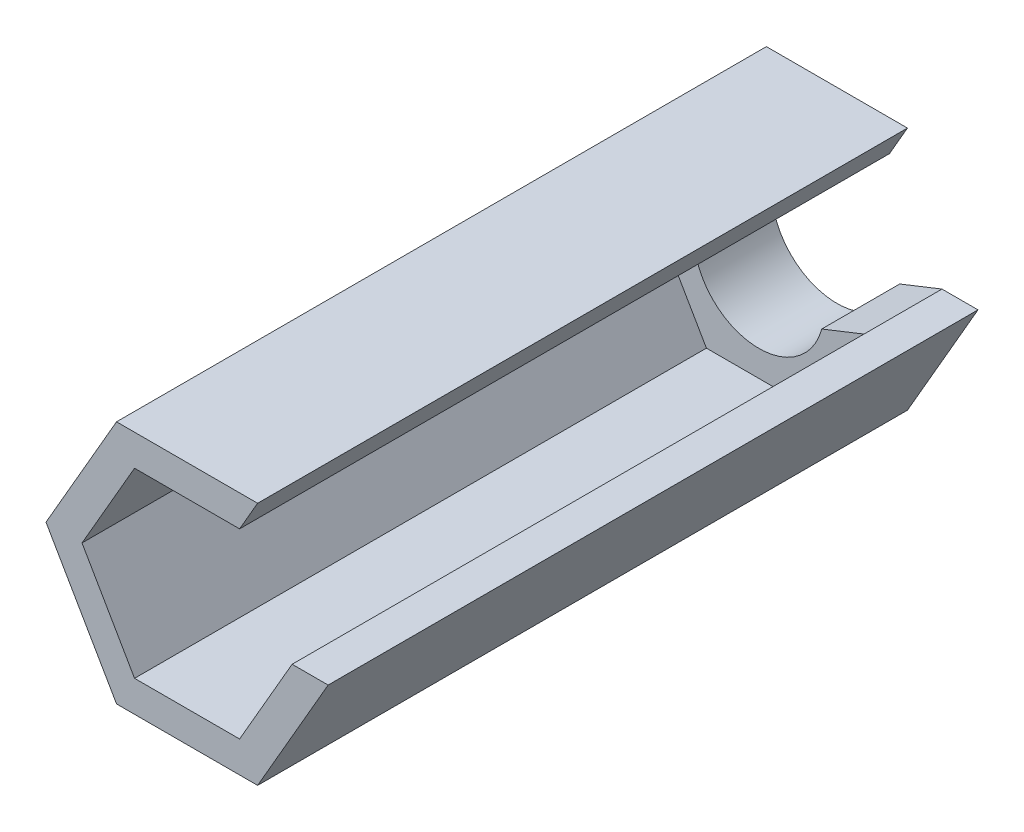
ISO-10303-21;
HEADER;
FILE_DESCRIPTION(('STEP AP214'),'2;1');
FILE_NAME('part.step','',(''),(''),'','','');
FILE_SCHEMA(('AUTOMOTIVE_DESIGN { 1 0 10303 214 1 1 1 1 }'));
ENDSEC;
DATA;
#1=APPLICATION_CONTEXT('core data for automotive mechanical design processes');
#2=APPLICATION_PROTOCOL_DEFINITION('international standard','automotive_design',2000,#1);
#3=PRODUCT_CONTEXT('',#1,'mechanical');
#4=PRODUCT('Part','Part','',(#3));
#5=PRODUCT_RELATED_PRODUCT_CATEGORY('part','',(#4));
#6=PRODUCT_DEFINITION_FORMATION('','',#4);
#7=PRODUCT_DEFINITION_CONTEXT('part definition',#1,'design');
#8=PRODUCT_DEFINITION('design','',#6,#7);
#9=PRODUCT_DEFINITION_SHAPE('','',#8);
#10=(LENGTH_UNIT() NAMED_UNIT(*) SI_UNIT(.MILLI.,.METRE.));
#11=(NAMED_UNIT(*) PLANE_ANGLE_UNIT() SI_UNIT($,.RADIAN.));
#12=(NAMED_UNIT(*) SI_UNIT($,.STERADIAN.) SOLID_ANGLE_UNIT());
#13=UNCERTAINTY_MEASURE_WITH_UNIT(LENGTH_MEASURE(1.E-05),#10,'distance_accuracy_value','');
#14=(GEOMETRIC_REPRESENTATION_CONTEXT(3) GLOBAL_UNCERTAINTY_ASSIGNED_CONTEXT((#13)) GLOBAL_UNIT_ASSIGNED_CONTEXT((#10,
#11,#12)) REPRESENTATION_CONTEXT('',''));
#15=CARTESIAN_POINT('',(0.,0.,0.));
#16=DIRECTION('',(0.,0.,1.));
#17=DIRECTION('',(1.,0.,0.));
#18=AXIS2_PLACEMENT_3D('',#15,#16,#17);
#19=CARTESIAN_POINT('',(5.13264389309574,0.,31.75));
#20=DIRECTION('',(0.,-1.,0.));
#21=DIRECTION('',(1.,0.,0.));
#22=AXIS2_PLACEMENT_3D('',#19,#20,#21);
#23=PLANE('',#22);
#24=DIRECTION('',(-1.,0.,0.));
#25=VECTOR('',#24,1.);
#26=CARTESIAN_POINT('',(5.13264389309574,0.,0.));
#27=LINE('',#26,#25);
#28=CARTESIAN_POINT('',(6.89240751358575,0.,0.));
#29=VERTEX_POINT('',#28);
#30=CARTESIAN_POINT('',(5.13264389309577,0.,0.));
#31=VERTEX_POINT('',#30);
#32=EDGE_CURVE('E153',#29,#31,#27,.T.);
#33=ORIENTED_EDGE('',*,*,#32,.T.);
#34=DIRECTION('',(0.,0.,-1.));
#35=VECTOR('',#34,1.);
#36=CARTESIAN_POINT('',(5.13264389309577,0.,3.81));
#37=LINE('',#36,#35);
#38=CARTESIAN_POINT('',(5.13264389309577,0.,3.81));
#39=VERTEX_POINT('',#38);
#40=EDGE_CURVE('E160',#39,#31,#37,.T.);
#41=ORIENTED_EDGE('',*,*,#40,.F.);
#42=DIRECTION('',(0.,0.,-1.));
#43=VECTOR('',#42,1.);
#44=CARTESIAN_POINT('',(5.13264389309574,0.,31.75));
#45=LINE('',#44,#43);
#46=CARTESIAN_POINT('',(5.13264389309574,0.,31.75));
#47=VERTEX_POINT('',#46);
#48=EDGE_CURVE('E11',#47,#39,#45,.T.);
#49=ORIENTED_EDGE('',*,*,#48,.F.);
#50=DIRECTION('',(-1.,0.,0.));
#51=VECTOR('',#50,1.);
#52=CARTESIAN_POINT('',(5.13264389309574,0.,31.75));
#53=LINE('',#52,#51);
#54=CARTESIAN_POINT('',(6.89240751358575,0.,31.75));
#55=VERTEX_POINT('',#54);
#56=EDGE_CURVE('E170',#55,#47,#53,.T.);
#57=ORIENTED_EDGE('',*,*,#56,.F.);
#58=DIRECTION('',(0.,0.,-1.));
#59=VECTOR('',#58,1.);
#60=CARTESIAN_POINT('',(6.89240751358575,0.,31.75));
#61=LINE('',#60,#59);
#62=EDGE_CURVE('E149',#55,#29,#61,.T.);
#63=ORIENTED_EDGE('',*,*,#62,.T.);
#64=EDGE_LOOP('',(#33,#41,#49,#57,#63));
#65=FACE_BOUND('',#64,.T.);
#66=ADVANCED_FACE('F39',(#65),#23,.F.);
#67=CARTESIAN_POINT('',(2.5663219465478,-4.44500000000005,31.75));
#68=DIRECTION('',(0.866025403784433,-0.50000000000001,0.));
#69=DIRECTION('',(0.50000000000001,0.866025403784433,0.));
#70=AXIS2_PLACEMENT_3D('',#67,#68,#69);
#71=PLANE('',#70);
#72=ORIENTED_EDGE('',*,*,#48,.T.);
#73=DIRECTION('',(-0.5,-0.866025403784439,0.));
#74=VECTOR('',#73,1.);
#75=CARTESIAN_POINT('',(5.13264389309577,0.,3.81));
#76=LINE('',#75,#74);
#77=CARTESIAN_POINT('',(2.56632194654789,-4.445,3.81));
#78=VERTEX_POINT('',#77);
#79=EDGE_CURVE('E201',#39,#78,#76,.T.);
#80=ORIENTED_EDGE('',*,*,#79,.T.);
#81=DIRECTION('',(0.,0.,-1.));
#82=VECTOR('',#81,1.);
#83=CARTESIAN_POINT('',(2.5663219465478,-4.44500000000005,31.75));
#84=LINE('',#83,#82);
#85=CARTESIAN_POINT('',(2.5663219465478,-4.44500000000005,31.75));
#86=VERTEX_POINT('',#85);
#87=EDGE_CURVE('E46',#86,#78,#84,.T.);
#88=ORIENTED_EDGE('',*,*,#87,.F.);
#89=DIRECTION('',(-0.50000000000001,-0.866025403784433,0.));
#90=VECTOR('',#89,1.);
#91=CARTESIAN_POINT('',(2.5663219465478,-4.44500000000005,31.75));
#92=LINE('',#91,#90);
#93=EDGE_CURVE('E100',#47,#86,#92,.T.);
#94=ORIENTED_EDGE('',*,*,#93,.F.);
#95=EDGE_LOOP('',(#72,#80,#88,#94));
#96=FACE_BOUND('',#95,.T.);
#97=ADVANCED_FACE('F203',(#96),#71,.F.);
#98=CARTESIAN_POINT('',(-2.56632194654797,-4.44499999999999,31.75));
#99=DIRECTION('',(0.,-1.,0.));
#100=DIRECTION('',(1.,0.,0.));
#101=AXIS2_PLACEMENT_3D('',#98,#99,#100);
#102=PLANE('',#101);
#103=ORIENTED_EDGE('',*,*,#87,.T.);
#104=DIRECTION('',(-1.,0.,0.));
#105=VECTOR('',#104,1.);
#106=CARTESIAN_POINT('',(2.56632194654789,-4.445,3.81));
#107=LINE('',#106,#105);
#108=CARTESIAN_POINT('',(-2.56632194654788,-4.445,3.81));
#109=VERTEX_POINT('',#108);
#110=EDGE_CURVE('E198',#78,#109,#107,.T.);
#111=ORIENTED_EDGE('',*,*,#110,.T.);
#112=DIRECTION('',(0.,0.,-1.));
#113=VECTOR('',#112,1.);
#114=CARTESIAN_POINT('',(-2.56632194654797,-4.44499999999999,31.75));
#115=LINE('',#114,#113);
#116=CARTESIAN_POINT('',(-2.56632194654797,-4.44499999999999,31.75));
#117=VERTEX_POINT('',#116);
#118=EDGE_CURVE('E186',#117,#109,#115,.T.);
#119=ORIENTED_EDGE('',*,*,#118,.F.);
#120=DIRECTION('',(-1.,0.,0.));
#121=VECTOR('',#120,1.);
#122=CARTESIAN_POINT('',(-2.56632194654797,-4.44499999999999,31.75));
#123=LINE('',#122,#121);
#124=EDGE_CURVE('E197',#86,#117,#123,.T.);
#125=ORIENTED_EDGE('',*,*,#124,.F.);
#126=EDGE_LOOP('',(#103,#111,#119,#125));
#127=FACE_BOUND('',#126,.T.);
#128=ADVANCED_FACE('F195',(#127),#102,.F.);
#129=CARTESIAN_POINT('',(-5.13264389309581,0.,31.75));
#130=DIRECTION('',(-0.866025403784444,-0.49999999999999,0.));
#131=DIRECTION('',(0.49999999999999,-0.866025403784444,0.));
#132=AXIS2_PLACEMENT_3D('',#129,#130,#131);
#133=PLANE('',#132);
#134=ORIENTED_EDGE('',*,*,#118,.T.);
#135=DIRECTION('',(-0.5,0.866025403784439,0.));
#136=VECTOR('',#135,1.);
#137=CARTESIAN_POINT('',(-2.56632194654788,-4.445,3.81));
#138=LINE('',#137,#136);
#139=CARTESIAN_POINT('',(-5.13264389309577,0.,3.81));
#140=VERTEX_POINT('',#139);
#141=EDGE_CURVE('E221',#109,#140,#138,.T.);
#142=ORIENTED_EDGE('',*,*,#141,.T.);
#143=DIRECTION('',(0.,0.,-1.));
#144=VECTOR('',#143,1.);
#145=CARTESIAN_POINT('',(-5.13264389309581,0.,31.75));
#146=LINE('',#145,#144);
#147=CARTESIAN_POINT('',(-5.13264389309581,0.,31.75));
#148=VERTEX_POINT('',#147);
#149=EDGE_CURVE('E181',#148,#140,#146,.T.);
#150=ORIENTED_EDGE('',*,*,#149,.F.);
#151=DIRECTION('',(-0.49999999999999,0.866025403784444,0.));
#152=VECTOR('',#151,1.);
#153=CARTESIAN_POINT('',(-5.13264389309581,0.,31.75));
#154=LINE('',#153,#152);
#155=EDGE_CURVE('E236',#117,#148,#154,.T.);
#156=ORIENTED_EDGE('',*,*,#155,.F.);
#157=EDGE_LOOP('',(#134,#142,#150,#156));
#158=FACE_BOUND('',#157,.T.);
#159=ADVANCED_FACE('F268',(#158),#133,.F.);
#160=CARTESIAN_POINT('',(-2.56632194654787,4.44500000000001,31.75));
#161=DIRECTION('',(-0.866025403784433,0.50000000000001,0.));
#162=DIRECTION('',(-0.50000000000001,-0.866025403784433,0.));
#163=AXIS2_PLACEMENT_3D('',#160,#161,#162);
#164=PLANE('',#163);
#165=ORIENTED_EDGE('',*,*,#149,.T.);
#166=DIRECTION('',(0.5,0.866025403784439,0.));
#167=VECTOR('',#166,1.);
#168=CARTESIAN_POINT('',(-5.13264389309577,0.,3.81));
#169=LINE('',#168,#167);
#170=CARTESIAN_POINT('',(-2.56632194654789,4.445,3.81));
#171=VERTEX_POINT('',#170);
#172=EDGE_CURVE('E304',#140,#171,#169,.T.);
#173=ORIENTED_EDGE('',*,*,#172,.T.);
#174=DIRECTION('',(0.,0.,-1.));
#175=VECTOR('',#174,1.);
#176=CARTESIAN_POINT('',(-2.56632194654787,4.44500000000001,31.75));
#177=LINE('',#176,#175);
#178=CARTESIAN_POINT('',(-2.56632194654787,4.44500000000001,31.75));
#179=VERTEX_POINT('',#178);
#180=EDGE_CURVE('E178',#179,#171,#177,.T.);
#181=ORIENTED_EDGE('',*,*,#180,.F.);
#182=DIRECTION('',(0.50000000000001,0.866025403784433,0.));
#183=VECTOR('',#182,1.);
#184=CARTESIAN_POINT('',(-2.56632194654787,4.44500000000001,31.75));
#185=LINE('',#184,#183);
#186=EDGE_CURVE('E238',#148,#179,#185,.T.);
#187=ORIENTED_EDGE('',*,*,#186,.F.);
#188=EDGE_LOOP('',(#165,#173,#181,#187));
#189=FACE_BOUND('',#188,.T.);
#190=ADVANCED_FACE('F274',(#189),#164,.F.);
#191=CARTESIAN_POINT('',(2.5663219465479,4.44499999999995,31.75));
#192=DIRECTION('',(0.,1.,0.));
#193=DIRECTION('',(-1.,0.,0.));
#194=AXIS2_PLACEMENT_3D('',#191,#192,#193);
#195=PLANE('',#194);
#196=ORIENTED_EDGE('',*,*,#180,.T.);
#197=DIRECTION('',(1.,0.,0.));
#198=VECTOR('',#197,1.);
#199=CARTESIAN_POINT('',(-2.56632194654789,4.445,3.81));
#200=LINE('',#199,#198);
#201=CARTESIAN_POINT('',(2.5663219465479,4.44499999999995,3.81));
#202=VERTEX_POINT('',#201);
#203=EDGE_CURVE('E281',#171,#202,#200,.T.);
#204=ORIENTED_EDGE('',*,*,#203,.T.);
#205=DIRECTION('',(0.,0.,-1.));
#206=VECTOR('',#205,1.);
#207=CARTESIAN_POINT('',(2.5663219465479,4.44499999999995,31.75));
#208=LINE('',#207,#206);
#209=CARTESIAN_POINT('',(2.5663219465479,4.44499999999995,31.75));
#210=VERTEX_POINT('',#209);
#211=EDGE_CURVE('E179',#210,#202,#208,.T.);
#212=ORIENTED_EDGE('',*,*,#211,.F.);
#213=DIRECTION('',(1.,0.,0.));
#214=VECTOR('',#213,1.);
#215=CARTESIAN_POINT('',(2.5663219465479,4.44499999999995,31.75));
#216=LINE('',#215,#214);
#217=EDGE_CURVE('E245',#179,#210,#216,.T.);
#218=ORIENTED_EDGE('',*,*,#217,.F.);
#219=EDGE_LOOP('',(#196,#204,#212,#218));
#220=FACE_BOUND('',#219,.T.);
#221=ADVANCED_FACE('F278',(#220),#195,.F.);
#222=CARTESIAN_POINT('',(2.5663219465479,4.44499999999995,31.75));
#223=DIRECTION('',(-0.866025403784428,0.500000000000018,0.));
#224=DIRECTION('',(-0.500000000000019,-0.866025403784428,0.));
#225=AXIS2_PLACEMENT_3D('',#222,#223,#224);
#226=PLANE('',#225);
#227=DIRECTION('',(0.500000000000018,0.866025403784428,0.));
#228=VECTOR('',#227,1.);
#229=CARTESIAN_POINT('',(2.5663219465479,4.44499999999995,0.));
#230=LINE('',#229,#228);
#231=CARTESIAN_POINT('',(2.56632194654789,4.445,0.));
#232=VERTEX_POINT('',#231);
#233=CARTESIAN_POINT('',(3.44620375679294,5.96899999999996,0.));
#234=VERTEX_POINT('',#233);
#235=EDGE_CURVE('E156',#232,#234,#230,.T.);
#236=ORIENTED_EDGE('',*,*,#235,.T.);
#237=DIRECTION('',(0.,0.,-1.));
#238=VECTOR('',#237,1.);
#239=CARTESIAN_POINT('',(3.44620375679294,5.96899999999996,31.75));
#240=LINE('',#239,#238);
#241=CARTESIAN_POINT('',(3.44620375679294,5.96899999999996,31.75));
#242=VERTEX_POINT('',#241);
#243=EDGE_CURVE('E173',#242,#234,#240,.T.);
#244=ORIENTED_EDGE('',*,*,#243,.F.);
#245=DIRECTION('',(0.500000000000018,0.866025403784428,0.));
#246=VECTOR('',#245,1.);
#247=CARTESIAN_POINT('',(2.5663219465479,4.44499999999995,31.75));
#248=LINE('',#247,#246);
#249=EDGE_CURVE('E243',#210,#242,#248,.T.);
#250=ORIENTED_EDGE('',*,*,#249,.F.);
#251=ORIENTED_EDGE('',*,*,#211,.T.);
#252=DIRECTION('',(0.,0.,-1.));
#253=VECTOR('',#252,1.);
#254=CARTESIAN_POINT('',(2.56632194654789,4.445,3.81));
#255=LINE('',#254,#253);
#256=EDGE_CURVE('E207',#202,#232,#255,.T.);
#257=ORIENTED_EDGE('',*,*,#256,.T.);
#258=EDGE_LOOP('',(#236,#244,#250,#251,#257));
#259=FACE_BOUND('',#258,.T.);
#260=ADVANCED_FACE('F282',(#259),#226,.F.);
#261=CARTESIAN_POINT('',(3.44620375679294,5.96899999999996,31.75));
#262=DIRECTION('',(0.,-1.,0.));
#263=DIRECTION('',(1.,0.,0.));
#264=AXIS2_PLACEMENT_3D('',#261,#262,#263);
#265=PLANE('',#264);
#266=DIRECTION('',(-1.,0.,0.));
#267=VECTOR('',#266,1.);
#268=CARTESIAN_POINT('',(3.44620375679294,5.96899999999996,0.));
#269=LINE('',#268,#267);
#270=CARTESIAN_POINT('',(-3.44620375679281,5.96900000000004,0.));
#271=VERTEX_POINT('',#270);
#272=EDGE_CURVE('E157',#234,#271,#269,.T.);
#273=ORIENTED_EDGE('',*,*,#272,.T.);
#274=DIRECTION('',(0.,0.,-1.));
#275=VECTOR('',#274,1.);
#276=CARTESIAN_POINT('',(-3.44620375679281,5.96900000000004,31.75));
#277=LINE('',#276,#275);
#278=CARTESIAN_POINT('',(-3.44620375679281,5.96900000000004,31.75));
#279=VERTEX_POINT('',#278);
#280=EDGE_CURVE('E171',#279,#271,#277,.T.);
#281=ORIENTED_EDGE('',*,*,#280,.F.);
#282=DIRECTION('',(-1.,0.,0.));
#283=VECTOR('',#282,1.);
#284=CARTESIAN_POINT('',(3.44620375679294,5.96899999999996,31.75));
#285=LINE('',#284,#283);
#286=EDGE_CURVE('E247',#242,#279,#285,.T.);
#287=ORIENTED_EDGE('',*,*,#286,.F.);
#288=ORIENTED_EDGE('',*,*,#243,.T.);
#289=EDGE_LOOP('',(#273,#281,#287,#288));
#290=FACE_BOUND('',#289,.T.);
#291=ADVANCED_FACE('F252',(#290),#265,.F.);
#292=CARTESIAN_POINT('',(-3.44620375679281,5.96900000000004,31.75));
#293=DIRECTION('',(0.866025403784433,-0.50000000000001,0.));
#294=DIRECTION('',(0.50000000000001,0.866025403784433,0.));
#295=AXIS2_PLACEMENT_3D('',#292,#293,#294);
#296=PLANE('',#295);
#297=DIRECTION('',(-0.50000000000001,-0.866025403784433,0.));
#298=VECTOR('',#297,1.);
#299=CARTESIAN_POINT('',(-3.44620375679281,5.96900000000004,0.));
#300=LINE('',#299,#298);
#301=CARTESIAN_POINT('',(-6.89240751358575,0.,0.));
#302=VERTEX_POINT('',#301);
#303=EDGE_CURVE('E161',#271,#302,#300,.T.);
#304=ORIENTED_EDGE('',*,*,#303,.T.);
#305=DIRECTION('',(0.,0.,-1.));
#306=VECTOR('',#305,1.);
#307=CARTESIAN_POINT('',(-6.89240751358575,0.,31.75));
#308=LINE('',#307,#306);
#309=CARTESIAN_POINT('',(-6.89240751358575,0.,31.75));
#310=VERTEX_POINT('',#309);
#311=EDGE_CURVE('E145',#310,#302,#308,.T.);
#312=ORIENTED_EDGE('',*,*,#311,.F.);
#313=DIRECTION('',(-0.50000000000001,-0.866025403784433,0.));
#314=VECTOR('',#313,1.);
#315=CARTESIAN_POINT('',(-3.44620375679281,5.96900000000004,31.75));
#316=LINE('',#315,#314);
#317=EDGE_CURVE('E135',#279,#310,#316,.T.);
#318=ORIENTED_EDGE('',*,*,#317,.F.);
#319=ORIENTED_EDGE('',*,*,#280,.T.);
#320=EDGE_LOOP('',(#304,#312,#318,#319));
#321=FACE_BOUND('',#320,.T.);
#322=ADVANCED_FACE('F258',(#321),#296,.F.);
#323=CARTESIAN_POINT('',(-6.89240751358575,0.,31.75));
#324=DIRECTION('',(0.866025403784444,0.49999999999999,0.));
#325=DIRECTION('',(-0.49999999999999,0.866025403784444,0.));
#326=AXIS2_PLACEMENT_3D('',#323,#324,#325);
#327=PLANE('',#326);
#328=DIRECTION('',(0.49999999999999,-0.866025403784444,0.));
#329=VECTOR('',#328,1.);
#330=CARTESIAN_POINT('',(-6.89240751358575,0.,0.));
#331=LINE('',#330,#329);
#332=CARTESIAN_POINT('',(-3.44620375679295,-5.96899999999996,0.));
#333=VERTEX_POINT('',#332);
#334=EDGE_CURVE('E143',#302,#333,#331,.T.);
#335=ORIENTED_EDGE('',*,*,#334,.T.);
#336=DIRECTION('',(0.,0.,-1.));
#337=VECTOR('',#336,1.);
#338=CARTESIAN_POINT('',(-3.44620375679295,-5.96899999999996,31.75));
#339=LINE('',#338,#337);
#340=CARTESIAN_POINT('',(-3.44620375679295,-5.96899999999996,31.75));
#341=VERTEX_POINT('',#340);
#342=EDGE_CURVE('E140',#341,#333,#339,.T.);
#343=ORIENTED_EDGE('',*,*,#342,.F.);
#344=DIRECTION('',(0.49999999999999,-0.866025403784444,0.));
#345=VECTOR('',#344,1.);
#346=CARTESIAN_POINT('',(-6.89240751358575,0.,31.75));
#347=LINE('',#346,#345);
#348=EDGE_CURVE('E123',#310,#341,#347,.T.);
#349=ORIENTED_EDGE('',*,*,#348,.F.);
#350=ORIENTED_EDGE('',*,*,#311,.T.);
#351=EDGE_LOOP('',(#335,#343,#349,#350));
#352=FACE_BOUND('',#351,.T.);
#353=ADVANCED_FACE('F136',(#352),#327,.F.);
#354=CARTESIAN_POINT('',(-3.44620375679295,-5.96899999999996,31.75));
#355=DIRECTION('',(0.,1.,0.));
#356=DIRECTION('',(-1.,0.,0.));
#357=AXIS2_PLACEMENT_3D('',#354,#355,#356);
#358=PLANE('',#357);
#359=DIRECTION('',(1.,0.,0.));
#360=VECTOR('',#359,1.);
#361=CARTESIAN_POINT('',(-3.44620375679295,-5.96899999999996,0.));
#362=LINE('',#361,#360);
#363=CARTESIAN_POINT('',(3.44620375679281,-5.96900000000004,0.));
#364=VERTEX_POINT('',#363);
#365=EDGE_CURVE('E163',#333,#364,#362,.T.);
#366=ORIENTED_EDGE('',*,*,#365,.T.);
#367=DIRECTION('',(0.,0.,-1.));
#368=VECTOR('',#367,1.);
#369=CARTESIAN_POINT('',(3.44620375679281,-5.96900000000004,31.75));
#370=LINE('',#369,#368);
#371=CARTESIAN_POINT('',(3.44620375679281,-5.96900000000004,31.75));
#372=VERTEX_POINT('',#371);
#373=EDGE_CURVE('E144',#372,#364,#370,.T.);
#374=ORIENTED_EDGE('',*,*,#373,.F.);
#375=DIRECTION('',(1.,0.,0.));
#376=VECTOR('',#375,1.);
#377=CARTESIAN_POINT('',(-3.44620375679295,-5.96899999999996,31.75));
#378=LINE('',#377,#376);
#379=EDGE_CURVE('E129',#341,#372,#378,.T.);
#380=ORIENTED_EDGE('',*,*,#379,.F.);
#381=ORIENTED_EDGE('',*,*,#342,.T.);
#382=EDGE_LOOP('',(#366,#374,#380,#381));
#383=FACE_BOUND('',#382,.T.);
#384=ADVANCED_FACE('F150',(#383),#358,.F.);
#385=CARTESIAN_POINT('',(3.44620375679281,-5.96900000000004,31.75));
#386=DIRECTION('',(-0.866025403784433,0.50000000000001,0.));
#387=DIRECTION('',(-0.50000000000001,-0.866025403784433,0.));
#388=AXIS2_PLACEMENT_3D('',#385,#386,#387);
#389=PLANE('',#388);
#390=DIRECTION('',(0.50000000000001,0.866025403784433,0.));
#391=VECTOR('',#390,1.);
#392=CARTESIAN_POINT('',(3.44620375679281,-5.96900000000004,0.));
#393=LINE('',#392,#391);
#394=EDGE_CURVE('E90',#364,#29,#393,.T.);
#395=ORIENTED_EDGE('',*,*,#394,.T.);
#396=ORIENTED_EDGE('',*,*,#62,.F.);
#397=DIRECTION('',(0.50000000000001,0.866025403784433,0.));
#398=VECTOR('',#397,1.);
#399=CARTESIAN_POINT('',(3.44620375679281,-5.96900000000004,31.75));
#400=LINE('',#399,#398);
#401=EDGE_CURVE('E65',#372,#55,#400,.T.);
#402=ORIENTED_EDGE('',*,*,#401,.F.);
#403=ORIENTED_EDGE('',*,*,#373,.T.);
#404=EDGE_LOOP('',(#395,#396,#402,#403));
#405=FACE_BOUND('',#404,.T.);
#406=ADVANCED_FACE('F257',(#405),#389,.F.);
#407=CARTESIAN_POINT('',(0.,0.,31.75));
#408=DIRECTION('',(0.,0.,1.));
#409=DIRECTION('',(1.,0.,0.));
#410=AXIS2_PLACEMENT_3D('',#407,#408,#409);
#411=PLANE('',#410);
#412=ORIENTED_EDGE('',*,*,#56,.T.);
#413=ORIENTED_EDGE('',*,*,#93,.T.);
#414=ORIENTED_EDGE('',*,*,#124,.T.);
#415=ORIENTED_EDGE('',*,*,#155,.T.);
#416=ORIENTED_EDGE('',*,*,#186,.T.);
#417=ORIENTED_EDGE('',*,*,#217,.T.);
#418=ORIENTED_EDGE('',*,*,#249,.T.);
#419=ORIENTED_EDGE('',*,*,#286,.T.);
#420=ORIENTED_EDGE('',*,*,#317,.T.);
#421=ORIENTED_EDGE('',*,*,#348,.T.);
#422=ORIENTED_EDGE('',*,*,#379,.T.);
#423=ORIENTED_EDGE('',*,*,#401,.T.);
#424=EDGE_LOOP('',(#412,#413,#414,#415,#416,#417,#418,#419,#420,#421,#422,#423));
#425=FACE_BOUND('',#424,.T.);
#426=ADVANCED_FACE('F130',(#425),#411,.T.);
#427=CARTESIAN_POINT('',(0.,0.,0.));
#428=DIRECTION('',(0.,0.,1.));
#429=DIRECTION('',(1.,0.,0.));
#430=AXIS2_PLACEMENT_3D('',#427,#428,#429);
#431=PLANE('',#430);
#432=ORIENTED_EDGE('',*,*,#32,.F.);
#433=ORIENTED_EDGE('',*,*,#394,.F.);
#434=ORIENTED_EDGE('',*,*,#365,.F.);
#435=ORIENTED_EDGE('',*,*,#334,.F.);
#436=ORIENTED_EDGE('',*,*,#303,.F.);
#437=ORIENTED_EDGE('',*,*,#272,.F.);
#438=ORIENTED_EDGE('',*,*,#235,.F.);
#439=DIRECTION('',(-0.783577787936287,-0.621293690820111,0.));
#440=VECTOR('',#439,1.);
#441=CARTESIAN_POINT('',(2.56632194654789,4.445,0.));
#442=LINE('',#441,#440);
#443=CARTESIAN_POINT('',(0.826529493148592,3.06552996999793,0.));
#444=VERTEX_POINT('',#443);
#445=EDGE_CURVE('E214',#232,#444,#442,.T.);
#446=ORIENTED_EDGE('',*,*,#445,.T.);
#447=CARTESIAN_POINT('',(0.,0.,0.));
#448=DIRECTION('',(0.,0.,1.));
#449=DIRECTION('',(-1.,0.,0.));
#450=AXIS2_PLACEMENT_3D('',#447,#448,#449);
#451=CIRCLE('',#450,3.175);
#452=CARTESIAN_POINT('',(3.06809157665505,-0.816969446955211,0.));
#453=VERTEX_POINT('',#452);
#454=EDGE_CURVE('E217',#444,#453,#451,.T.);
#455=ORIENTED_EDGE('',*,*,#454,.T.);
#456=DIRECTION('',(0.929845013429354,0.367951424783985,0.));
#457=VECTOR('',#456,1.);
#458=CARTESIAN_POINT('',(5.13264389309577,0.,0.));
#459=LINE('',#458,#457);
#460=EDGE_CURVE('E222',#453,#31,#459,.T.);
#461=ORIENTED_EDGE('',*,*,#460,.T.);
#462=EDGE_LOOP('',(#432,#433,#434,#435,#436,#437,#438,#446,#455,#461));
#463=FACE_BOUND('',#462,.T.);
#464=ADVANCED_FACE('F259',(#463),#431,.F.);
#465=CARTESIAN_POINT('',(5.13264389309577,0.,3.81));
#466=DIRECTION('',(-0.367951424783985,0.929845013429354,0.));
#467=DIRECTION('',(-0.929845013429354,-0.367951424783985,0.));
#468=AXIS2_PLACEMENT_3D('',#465,#466,#467);
#469=PLANE('',#468);
#470=ORIENTED_EDGE('',*,*,#460,.F.);
#471=DIRECTION('',(0.,0.,-1.));
#472=VECTOR('',#471,1.);
#473=CARTESIAN_POINT('',(3.06809157665505,-0.816969446955211,3.81));
#474=LINE('',#473,#472);
#475=CARTESIAN_POINT('',(3.06809157665505,-0.816969446955211,3.81));
#476=VERTEX_POINT('',#475);
#477=EDGE_CURVE('E230',#476,#453,#474,.T.);
#478=ORIENTED_EDGE('',*,*,#477,.F.);
#479=DIRECTION('',(0.929845013429354,0.367951424783985,0.));
#480=VECTOR('',#479,1.);
#481=CARTESIAN_POINT('',(5.13264389309577,0.,3.81));
#482=LINE('',#481,#480);
#483=EDGE_CURVE('E210',#476,#39,#482,.T.);
#484=ORIENTED_EDGE('',*,*,#483,.T.);
#485=ORIENTED_EDGE('',*,*,#40,.T.);
#486=EDGE_LOOP('',(#470,#478,#484,#485));
#487=FACE_BOUND('',#486,.T.);
#488=ADVANCED_FACE('F309',(#487),#469,.T.);
#489=CARTESIAN_POINT('',(0.,0.,3.81));
#490=DIRECTION('',(0.,0.,-1.));
#491=DIRECTION('',(-1.,0.,0.));
#492=AXIS2_PLACEMENT_3D('',#489,#490,#491);
#493=CYLINDRICAL_SURFACE('',#492,3.175);
#494=ORIENTED_EDGE('',*,*,#454,.F.);
#495=DIRECTION('',(0.,0.,-1.));
#496=VECTOR('',#495,1.);
#497=CARTESIAN_POINT('',(0.826529493148592,3.06552996999793,3.81));
#498=LINE('',#497,#496);
#499=CARTESIAN_POINT('',(0.826529493148592,3.06552996999793,3.81));
#500=VERTEX_POINT('',#499);
#501=EDGE_CURVE('E229',#500,#444,#498,.T.);
#502=ORIENTED_EDGE('',*,*,#501,.F.);
#503=CARTESIAN_POINT('',(0.,0.,3.81));
#504=DIRECTION('',(0.,0.,1.));
#505=DIRECTION('',(-1.,0.,0.));
#506=AXIS2_PLACEMENT_3D('',#503,#504,#505);
#507=CIRCLE('',#506,3.175);
#508=EDGE_CURVE('E211',#500,#476,#507,.T.);
#509=ORIENTED_EDGE('',*,*,#508,.T.);
#510=ORIENTED_EDGE('',*,*,#477,.T.);
#511=EDGE_LOOP('',(#494,#502,#509,#510));
#512=FACE_BOUND('',#511,.T.);
#513=ADVANCED_FACE('F315',(#512),#493,.F.);
#514=CARTESIAN_POINT('',(2.56632194654789,4.445,3.81));
#515=DIRECTION('',(0.621293690820111,-0.783577787936287,0.));
#516=DIRECTION('',(0.783577787936287,0.621293690820111,0.));
#517=AXIS2_PLACEMENT_3D('',#514,#515,#516);
#518=PLANE('',#517);
#519=ORIENTED_EDGE('',*,*,#445,.F.);
#520=ORIENTED_EDGE('',*,*,#256,.F.);
#521=DIRECTION('',(-0.783577787936287,-0.621293690820111,0.));
#522=VECTOR('',#521,1.);
#523=CARTESIAN_POINT('',(2.56632194654789,4.445,3.81));
#524=LINE('',#523,#522);
#525=EDGE_CURVE('E52',#202,#500,#524,.T.);
#526=ORIENTED_EDGE('',*,*,#525,.T.);
#527=ORIENTED_EDGE('',*,*,#501,.T.);
#528=EDGE_LOOP('',(#519,#520,#526,#527));
#529=FACE_BOUND('',#528,.T.);
#530=ADVANCED_FACE('F320',(#529),#518,.T.);
#531=CARTESIAN_POINT('',(0.,0.,3.81));
#532=DIRECTION('',(0.,0.,-1.));
#533=DIRECTION('',(-1.,0.,0.));
#534=AXIS2_PLACEMENT_3D('',#531,#532,#533);
#535=PLANE('',#534);
#536=ORIENTED_EDGE('',*,*,#141,.F.);
#537=ORIENTED_EDGE('',*,*,#110,.F.);
#538=ORIENTED_EDGE('',*,*,#79,.F.);
#539=ORIENTED_EDGE('',*,*,#483,.F.);
#540=ORIENTED_EDGE('',*,*,#508,.F.);
#541=ORIENTED_EDGE('',*,*,#525,.F.);
#542=ORIENTED_EDGE('',*,*,#203,.F.);
#543=ORIENTED_EDGE('',*,*,#172,.F.);
#544=EDGE_LOOP('',(#536,#537,#538,#539,#540,#541,#542,#543));
#545=FACE_BOUND('',#544,.T.);
#546=ADVANCED_FACE('F313',(#545),#535,.F.);
#547=CLOSED_SHELL('',(#66,#97,#128,#159,#190,#221,#260,#291,#322,#353,#384,#406,#426,#464,#488,
#513,#530,#546));
#548=MANIFOLD_SOLID_BREP('B2',#547);
#549=ADVANCED_BREP_SHAPE_REPRESENTATION('',(#18,#548),#14);
#550=SHAPE_DEFINITION_REPRESENTATION(#9,#549);
ENDSEC;
END-ISO-10303-21;
